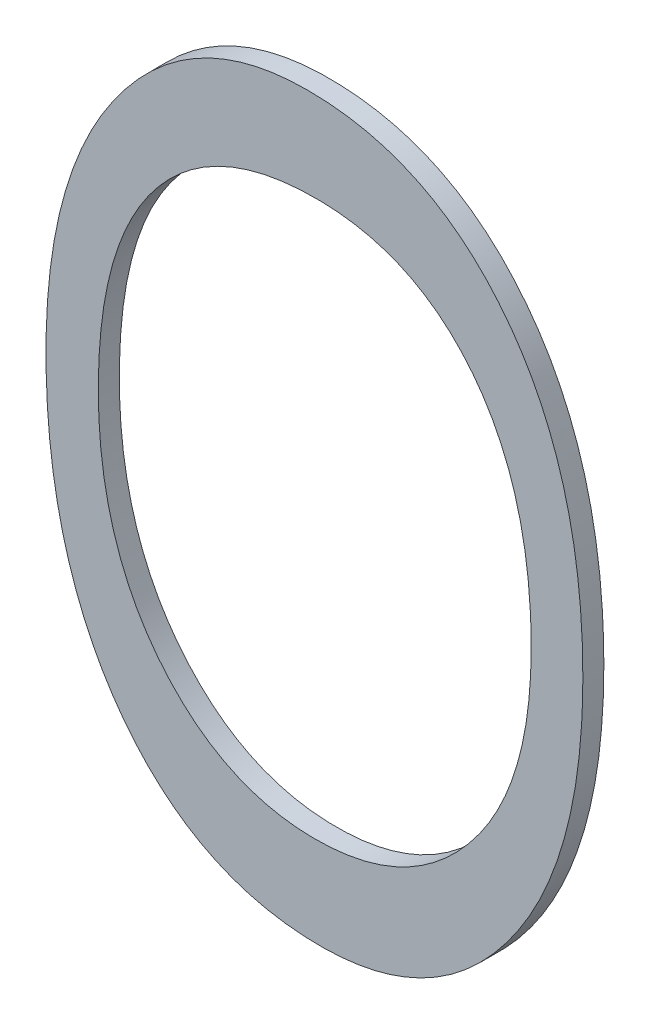
ISO-10303-21;
HEADER;
FILE_DESCRIPTION(('STEP AP214'),'2;1');
FILE_NAME('part.step','',(''),(''),'','','');
FILE_SCHEMA(('AUTOMOTIVE_DESIGN { 1 0 10303 214 1 1 1 1 }'));
ENDSEC;
DATA;
#1=APPLICATION_CONTEXT('core data for automotive mechanical design processes');
#2=APPLICATION_PROTOCOL_DEFINITION('international standard','automotive_design',2000,#1);
#3=PRODUCT_CONTEXT('',#1,'mechanical');
#4=PRODUCT('Part','Part','',(#3));
#5=PRODUCT_RELATED_PRODUCT_CATEGORY('part','',(#4));
#6=PRODUCT_DEFINITION_FORMATION('','',#4);
#7=PRODUCT_DEFINITION_CONTEXT('part definition',#1,'design');
#8=PRODUCT_DEFINITION('design','',#6,#7);
#9=PRODUCT_DEFINITION_SHAPE('','',#8);
#10=(LENGTH_UNIT() NAMED_UNIT(*) SI_UNIT(.MILLI.,.METRE.));
#11=(NAMED_UNIT(*) PLANE_ANGLE_UNIT() SI_UNIT($,.RADIAN.));
#12=(NAMED_UNIT(*) SI_UNIT($,.STERADIAN.) SOLID_ANGLE_UNIT());
#13=UNCERTAINTY_MEASURE_WITH_UNIT(LENGTH_MEASURE(1.E-05),#10,'distance_accuracy_value','');
#14=(GEOMETRIC_REPRESENTATION_CONTEXT(3) GLOBAL_UNCERTAINTY_ASSIGNED_CONTEXT((#13)) GLOBAL_UNIT_ASSIGNED_CONTEXT((#10,
#11,#12)) REPRESENTATION_CONTEXT('',''));
#15=CARTESIAN_POINT('',(0.,0.,0.));
#16=DIRECTION('',(0.,0.,1.));
#17=DIRECTION('',(1.,0.,0.));
#18=AXIS2_PLACEMENT_3D('',#15,#16,#17);
#19=CARTESIAN_POINT('',(-8.95983005625009,-22.7704584365744,333.160489148867));
#20=DIRECTION('',(0.,0.,1.));
#21=DIRECTION('',(1.,0.,0.));
#22=AXIS2_PLACEMENT_3D('',#19,#20,#21);
#23=PLANE('',#22);
#24=CARTESIAN_POINT('',(-6.29001147151449,-79.176051101585,333.160489148867));
#25=CARTESIAN_POINT('',(-6.29001147151449,-80.742025489398,333.160489148867));
#26=CARTESIAN_POINT('',(-6.63960220039776,-82.0003121806367,333.160489148867));
#27=CARTESIAN_POINT('',(-8.03796444627411,-83.9015105397462,333.160489148867));
#28=CARTESIAN_POINT('',(-8.936683522284,-84.3768098944461,333.160489148867));
#29=CARTESIAN_POINT('',(-11.2257835823802,-84.3768098944461,333.160489148867));
#30=CARTESIAN_POINT('',(-12.1771811794543,-83.891932885113,333.160489148867));
#31=CARTESIAN_POINT('',(-13.6010836890156,-81.9524230630158,333.160489148867));
#32=CARTESIAN_POINT('',(-13.9570599991587,-80.6414583319461,333.160489148867));
#33=CARTESIAN_POINT('',(-13.9570599991587,-77.4568320534357,333.160489148867));
#34=CARTESIAN_POINT('',(-13.6090662372385,-76.2224897140207,333.160489148867));
#35=CARTESIAN_POINT('',(-12.2170884201205,-74.3500252250102,333.160489148867));
#36=CARTESIAN_POINT('',(-11.3199653987747,-73.881908677499,333.160489148867));
#37=CARTESIAN_POINT('',(-9.03725067973593,-73.881908677499,333.160489148867));
#38=CARTESIAN_POINT('',(-8.08585302825645,-74.3548141008107,333.160489148867));
#39=CARTESIAN_POINT('',(-6.64917989098564,-76.2464344798179,333.160489148867));
#40=CARTESIAN_POINT('',(-6.29001147151449,-77.5382431877153,333.160489148867));
#41=CARTESIAN_POINT('',(-6.29001147151449,-79.176051101585,333.160489148867));
#42=(BOUNDED_CURVE() B_SPLINE_CURVE(3,(#24,#25,#26,#27,#28,#29,#30,#31,#32,#33,#34,#35,#36,#37,
#38,#39,#40,#41),.UNSPECIFIED.,.T.,.F.) B_SPLINE_CURVE_WITH_KNOTS((4,2,2,2,2,2,2,2,4),(0.,
0.119769127317099,0.239538277576526,0.369404228018848,0.499270130659375,0.619725441865199,
0.740180683109992,0.87009029267056,1.),
.UNSPECIFIED.) CURVE() GEOMETRIC_REPRESENTATION_ITEM() RATIONAL_B_SPLINE_CURVE((1.,1.,1.,1.,1.,
1.,1.,1.,1.,1.,1.,1.,1.,1.,1.,1.,1.,1.)) REPRESENTATION_ITEM(''));
#43=CARTESIAN_POINT('',(-6.29001147151449,-79.176051101585,333.160489148867));
#44=VERTEX_POINT('',#43);
#45=EDGE_CURVE('E11',#44,#44,#42,.T.);
#46=ORIENTED_EDGE('',*,*,#45,.T.);
#47=EDGE_LOOP('',(#46));
#48=FACE_BOUND('',#47,.T.);
#49=CARTESIAN_POINT('',(-7.02750395949526,-79.1832344962807,333.160489148867));
#50=CARTESIAN_POINT('',(-7.02750395949526,-77.914172987162,333.160489148867));
#51=CARTESIAN_POINT('',(-7.30286614229541,-76.9264596214489,333.160489148867));
#52=CARTESIAN_POINT('',(-8.40431623413468,-75.5137309040967,333.160489148867));
#53=CARTESIAN_POINT('',(-9.1521845739667,-75.1605482508163,333.160489148867));
#54=CARTESIAN_POINT('',(-11.0741348188703,-75.1605482508163,333.160489148867));
#55=CARTESIAN_POINT('',(-11.8371686510976,-75.5017576632795,333.160489148867));
#56=CARTESIAN_POINT('',(-12.9354248849291,-76.8665988045049,333.160489148867));
#57=CARTESIAN_POINT('',(-13.2099896866587,-77.8327618528824,333.160489148867));
#58=CARTESIAN_POINT('',(-13.2099896866587,-80.2990512924505,333.160489148867));
#59=CARTESIAN_POINT('',(-12.9170677273582,-81.2712004600546,333.160489148867));
#60=CARTESIAN_POINT('',(-11.7453805625484,-82.7270298080755,333.160489148867));
#61=CARTESIAN_POINT('',(-11.0054936184378,-83.0909869527394,333.160489148867));
#62=CARTESIAN_POINT('',(-9.22082577439911,-83.0909869527394,333.160489148867));
#63=CARTESIAN_POINT('',(-8.48413167465649,-82.7366072423704,333.160489148867));
#64=CARTESIAN_POINT('',(-7.31882920586602,-81.3190896037486,333.160489148867));
#65=CARTESIAN_POINT('',(-7.02750395949526,-80.3708849763447,333.160489148867));
#66=CARTESIAN_POINT('',(-7.02750395949526,-79.1832344962807,333.160489148867));
#67=(BOUNDED_CURVE() B_SPLINE_CURVE(3,(#49,#50,#51,#52,#53,#54,#55,#56,#57,#58,#59,#60,#61,#62,
#63,#64,#65,#66),.UNSPECIFIED.,.T.,.F.) B_SPLINE_CURVE_WITH_KNOTS((4,2,2,2,2,2,2,2,4),(0.,
0.123691768703719,0.247383476288094,0.375253953351849,0.503124425762321,0.627565480981364,
0.752006596553877,0.876003296869422,1.),
.UNSPECIFIED.) CURVE() GEOMETRIC_REPRESENTATION_ITEM() RATIONAL_B_SPLINE_CURVE((1.,1.,1.,1.,1.,
1.,1.,1.,1.,1.,1.,1.,1.,1.,1.,1.,1.,1.)) REPRESENTATION_ITEM(''));
#68=CARTESIAN_POINT('',(-7.02750395949526,-79.1832344962807,333.160489148867));
#69=VERTEX_POINT('',#68);
#70=EDGE_CURVE('E73',#69,#69,#67,.T.);
#71=ORIENTED_EDGE('',*,*,#70,.T.);
#72=EDGE_LOOP('',(#71));
#73=FACE_BOUND('',#72,.T.);
#74=ADVANCED_FACE('F43',(#48,#73),#23,.F.);
#75=CARTESIAN_POINT('',(-6.29001147151449,-79.176051101585,332.960489148867));
#76=CARTESIAN_POINT('',(-6.29001147151449,-80.742025489398,332.960489148867));
#77=CARTESIAN_POINT('',(-6.63960220039776,-82.0003121806367,332.960489148867));
#78=CARTESIAN_POINT('',(-8.03796444627411,-83.9015105397462,332.960489148867));
#79=CARTESIAN_POINT('',(-8.936683522284,-84.3768098944461,332.960489148867));
#80=CARTESIAN_POINT('',(-11.2257835823802,-84.3768098944461,332.960489148867));
#81=CARTESIAN_POINT('',(-12.1771811794543,-83.891932885113,332.960489148867));
#82=CARTESIAN_POINT('',(-13.6010836890156,-81.9524230630158,332.960489148867));
#83=CARTESIAN_POINT('',(-13.9570599991587,-80.6414583319461,332.960489148867));
#84=CARTESIAN_POINT('',(-13.9570599991587,-77.4568320534357,332.960489148867));
#85=CARTESIAN_POINT('',(-13.6090662372385,-76.2224897140207,332.960489148867));
#86=CARTESIAN_POINT('',(-12.2170884201205,-74.3500252250102,332.960489148867));
#87=CARTESIAN_POINT('',(-11.3199653987747,-73.881908677499,332.960489148867));
#88=CARTESIAN_POINT('',(-9.03725067973593,-73.881908677499,332.960489148867));
#89=CARTESIAN_POINT('',(-8.08585302825645,-74.3548141008107,332.960489148867));
#90=CARTESIAN_POINT('',(-6.64917989098564,-76.2464344798179,332.960489148867));
#91=CARTESIAN_POINT('',(-6.29001147151449,-77.5382431877153,332.960489148867));
#92=CARTESIAN_POINT('',(-6.29001147151449,-79.176051101585,332.960489148867));
#93=(BOUNDED_CURVE() B_SPLINE_CURVE(3,(#75,#76,#77,#78,#79,#80,#81,#82,#83,#84,#85,#86,#87,#88,
#89,#90,#91,#92),.UNSPECIFIED.,.T.,.F.) B_SPLINE_CURVE_WITH_KNOTS((4,2,2,2,2,2,2,2,4),(0.,
0.119769127317099,0.239538277576526,0.369404228018848,0.499270130659375,0.619725441865199,
0.740180683109992,0.87009029267056,1.),
.UNSPECIFIED.) CURVE() GEOMETRIC_REPRESENTATION_ITEM() RATIONAL_B_SPLINE_CURVE((1.,1.,1.,1.,1.,
1.,1.,1.,1.,1.,1.,1.,1.,1.,1.,1.,1.,1.)) REPRESENTATION_ITEM(''));
#94=DIRECTION('',(0.,0.,1.));
#95=VECTOR('',#94,1.);
#96=SURFACE_OF_LINEAR_EXTRUSION('',#93,#95);
#97=ORIENTED_EDGE('',*,*,#45,.F.);
#98=EDGE_LOOP('',(#97));
#99=FACE_BOUND('',#98,.T.);
#100=CARTESIAN_POINT('',(-6.29001147151449,-79.176051101585,333.460489148867));
#101=CARTESIAN_POINT('',(-6.29001147151449,-77.5382431877153,333.460489148867));
#102=CARTESIAN_POINT('',(-6.64917989098564,-76.2464344798179,333.460489148867));
#103=CARTESIAN_POINT('',(-8.08585302825645,-74.3548141008107,333.460489148867));
#104=CARTESIAN_POINT('',(-9.03725067973593,-73.881908677499,333.460489148867));
#105=CARTESIAN_POINT('',(-11.3199653987747,-73.881908677499,333.460489148867));
#106=CARTESIAN_POINT('',(-12.2170884201205,-74.3500252250102,333.460489148867));
#107=CARTESIAN_POINT('',(-13.6090662372385,-76.2224897140207,333.460489148867));
#108=CARTESIAN_POINT('',(-13.9570599991587,-77.4568320534357,333.460489148867));
#109=CARTESIAN_POINT('',(-13.9570599991587,-80.6414583319461,333.460489148867));
#110=CARTESIAN_POINT('',(-13.6010836890156,-81.9524230630158,333.460489148867));
#111=CARTESIAN_POINT('',(-12.1771811794543,-83.891932885113,333.460489148867));
#112=CARTESIAN_POINT('',(-11.2257835823802,-84.3768098944461,333.460489148867));
#113=CARTESIAN_POINT('',(-8.936683522284,-84.3768098944461,333.460489148867));
#114=CARTESIAN_POINT('',(-8.03796444627411,-83.9015105397462,333.460489148867));
#115=CARTESIAN_POINT('',(-6.63960220039776,-82.0003121806367,333.460489148867));
#116=CARTESIAN_POINT('',(-6.29001147151449,-80.742025489398,333.460489148867));
#117=CARTESIAN_POINT('',(-6.29001147151449,-79.176051101585,333.460489148867));
#118=(BOUNDED_CURVE() B_SPLINE_CURVE(3,(#100,#101,#102,#103,#104,#105,#106,#107,#108,#109,#110,
#111,#112,#113,#114,#115,#116,#117),.UNSPECIFIED.,.T.,.F.) B_SPLINE_CURVE_WITH_KNOTS((4,2,2,2,2,
2,2,2,4),(0.,0.12990970732944,0.259819316890008,0.380274558134801,0.500729869340625,
0.630595771981152,0.760461722423474,0.880230872682901,1.),
.UNSPECIFIED.) CURVE() GEOMETRIC_REPRESENTATION_ITEM() RATIONAL_B_SPLINE_CURVE((1.,1.,1.,1.,1.,
1.,1.,1.,1.,1.,1.,1.,1.,1.,1.,1.,1.,1.)) REPRESENTATION_ITEM(''));
#119=CARTESIAN_POINT('',(-6.29001147151449,-79.176051101585,333.460489148867));
#120=VERTEX_POINT('',#119);
#121=EDGE_CURVE('E48',#120,#120,#118,.T.);
#122=ORIENTED_EDGE('',*,*,#121,.F.);
#123=EDGE_LOOP('',(#122));
#124=FACE_BOUND('',#123,.T.);
#125=ADVANCED_FACE('F45',(#99,#124),#96,.F.);
#126=CARTESIAN_POINT('',(-13.9570216698443,-78.9614599660253,333.460489148867));
#127=DIRECTION('',(0.,0.,-1.));
#128=DIRECTION('',(0.,-1.,0.));
#129=AXIS2_PLACEMENT_3D('',#126,#127,#128);
#130=PLANE('',#129);
#131=ORIENTED_EDGE('',*,*,#121,.T.);
#132=EDGE_LOOP('',(#131));
#133=FACE_BOUND('',#132,.T.);
#134=CARTESIAN_POINT('',(-7.02750395949526,-79.1832344962807,333.460489148867));
#135=CARTESIAN_POINT('',(-7.02750395949526,-80.3708849763447,333.460489148867));
#136=CARTESIAN_POINT('',(-7.31882920586602,-81.3190896037486,333.460489148867));
#137=CARTESIAN_POINT('',(-8.48413167465649,-82.7366072423704,333.460489148867));
#138=CARTESIAN_POINT('',(-9.22082577439911,-83.0909869527394,333.460489148867));
#139=CARTESIAN_POINT('',(-11.0054936184378,-83.0909869527394,333.460489148867));
#140=CARTESIAN_POINT('',(-11.7453805625484,-82.7270298080755,333.460489148867));
#141=CARTESIAN_POINT('',(-12.9170677273582,-81.2712004600546,333.460489148867));
#142=CARTESIAN_POINT('',(-13.2099896866587,-80.2990512924505,333.460489148867));
#143=CARTESIAN_POINT('',(-13.2099896866587,-77.8327618528824,333.460489148867));
#144=CARTESIAN_POINT('',(-12.9354248849291,-76.8665988045049,333.460489148867));
#145=CARTESIAN_POINT('',(-11.8371686510976,-75.5017576632795,333.460489148867));
#146=CARTESIAN_POINT('',(-11.0741348188703,-75.1605482508163,333.460489148867));
#147=CARTESIAN_POINT('',(-9.1521845739667,-75.1605482508163,333.460489148867));
#148=CARTESIAN_POINT('',(-8.40431623413468,-75.5137309040967,333.460489148867));
#149=CARTESIAN_POINT('',(-7.30286614229541,-76.9264596214489,333.460489148867));
#150=CARTESIAN_POINT('',(-7.02750395949526,-77.914172987162,333.460489148867));
#151=CARTESIAN_POINT('',(-7.02750395949526,-79.1832344962807,333.460489148867));
#152=(BOUNDED_CURVE() B_SPLINE_CURVE(3,(#134,#135,#136,#137,#138,#139,#140,#141,#142,#143,#144,
#145,#146,#147,#148,#149,#150,#151),.UNSPECIFIED.,.T.,.F.) B_SPLINE_CURVE_WITH_KNOTS((4,2,2,2,2,
2,2,2,4),(0.,0.123996703130578,0.247993403446123,0.372434519018636,0.496875574237679,
0.624746046648151,0.752616523711906,0.876308231296281,1.),
.UNSPECIFIED.) CURVE() GEOMETRIC_REPRESENTATION_ITEM() RATIONAL_B_SPLINE_CURVE((1.,1.,1.,1.,1.,
1.,1.,1.,1.,1.,1.,1.,1.,1.,1.,1.,1.,1.)) REPRESENTATION_ITEM(''));
#153=CARTESIAN_POINT('',(-7.02750395949526,-79.1832344962807,333.460489148867));
#154=VERTEX_POINT('',#153);
#155=EDGE_CURVE('E70',#154,#154,#152,.T.);
#156=ORIENTED_EDGE('',*,*,#155,.T.);
#157=EDGE_LOOP('',(#156));
#158=FACE_BOUND('',#157,.T.);
#159=ADVANCED_FACE('F71',(#133,#158),#130,.F.);
#160=CARTESIAN_POINT('',(-7.02750395949526,-79.1832344962807,332.960489148867));
#161=CARTESIAN_POINT('',(-7.02750395949526,-77.914172987162,332.960489148867));
#162=CARTESIAN_POINT('',(-7.30286614229541,-76.9264596214489,332.960489148867));
#163=CARTESIAN_POINT('',(-8.40431623413468,-75.5137309040967,332.960489148867));
#164=CARTESIAN_POINT('',(-9.1521845739667,-75.1605482508163,332.960489148867));
#165=CARTESIAN_POINT('',(-11.0741348188703,-75.1605482508163,332.960489148867));
#166=CARTESIAN_POINT('',(-11.8371686510976,-75.5017576632795,332.960489148867));
#167=CARTESIAN_POINT('',(-12.9354248849291,-76.8665988045049,332.960489148867));
#168=CARTESIAN_POINT('',(-13.2099896866587,-77.8327618528824,332.960489148867));
#169=CARTESIAN_POINT('',(-13.2099896866587,-80.2990512924505,332.960489148867));
#170=CARTESIAN_POINT('',(-12.9170677273582,-81.2712004600546,332.960489148867));
#171=CARTESIAN_POINT('',(-11.7453805625484,-82.7270298080755,332.960489148867));
#172=CARTESIAN_POINT('',(-11.0054936184378,-83.0909869527394,332.960489148867));
#173=CARTESIAN_POINT('',(-9.22082577439911,-83.0909869527394,332.960489148867));
#174=CARTESIAN_POINT('',(-8.48413167465649,-82.7366072423704,332.960489148867));
#175=CARTESIAN_POINT('',(-7.31882920586602,-81.3190896037486,332.960489148867));
#176=CARTESIAN_POINT('',(-7.02750395949526,-80.3708849763447,332.960489148867));
#177=CARTESIAN_POINT('',(-7.02750395949526,-79.1832344962807,332.960489148867));
#178=(BOUNDED_CURVE() B_SPLINE_CURVE(3,(#160,#161,#162,#163,#164,#165,#166,#167,#168,#169,#170,
#171,#172,#173,#174,#175,#176,#177),.UNSPECIFIED.,.T.,.F.) B_SPLINE_CURVE_WITH_KNOTS((4,2,2,2,2,
2,2,2,4),(0.,0.123691768703719,0.247383476288094,0.375253953351849,0.503124425762321,
0.627565480981364,0.752006596553877,0.876003296869422,1.),
.UNSPECIFIED.) CURVE() GEOMETRIC_REPRESENTATION_ITEM() RATIONAL_B_SPLINE_CURVE((1.,1.,1.,1.,1.,
1.,1.,1.,1.,1.,1.,1.,1.,1.,1.,1.,1.,1.)) REPRESENTATION_ITEM(''));
#179=DIRECTION('',(0.,0.,1.));
#180=VECTOR('',#179,1.);
#181=SURFACE_OF_LINEAR_EXTRUSION('',#178,#180);
#182=ORIENTED_EDGE('',*,*,#70,.F.);
#183=EDGE_LOOP('',(#182));
#184=FACE_BOUND('',#183,.T.);
#185=ORIENTED_EDGE('',*,*,#155,.F.);
#186=EDGE_LOOP('',(#185));
#187=FACE_BOUND('',#186,.T.);
#188=ADVANCED_FACE('F103',(#184,#187),#181,.F.);
#189=CLOSED_SHELL('',(#74,#125,#159,#188));
#190=MANIFOLD_SOLID_BREP('B2',#189);
#191=ADVANCED_BREP_SHAPE_REPRESENTATION('',(#18,#190),#14);
#192=SHAPE_DEFINITION_REPRESENTATION(#9,#191);
ENDSEC;
END-ISO-10303-21;
